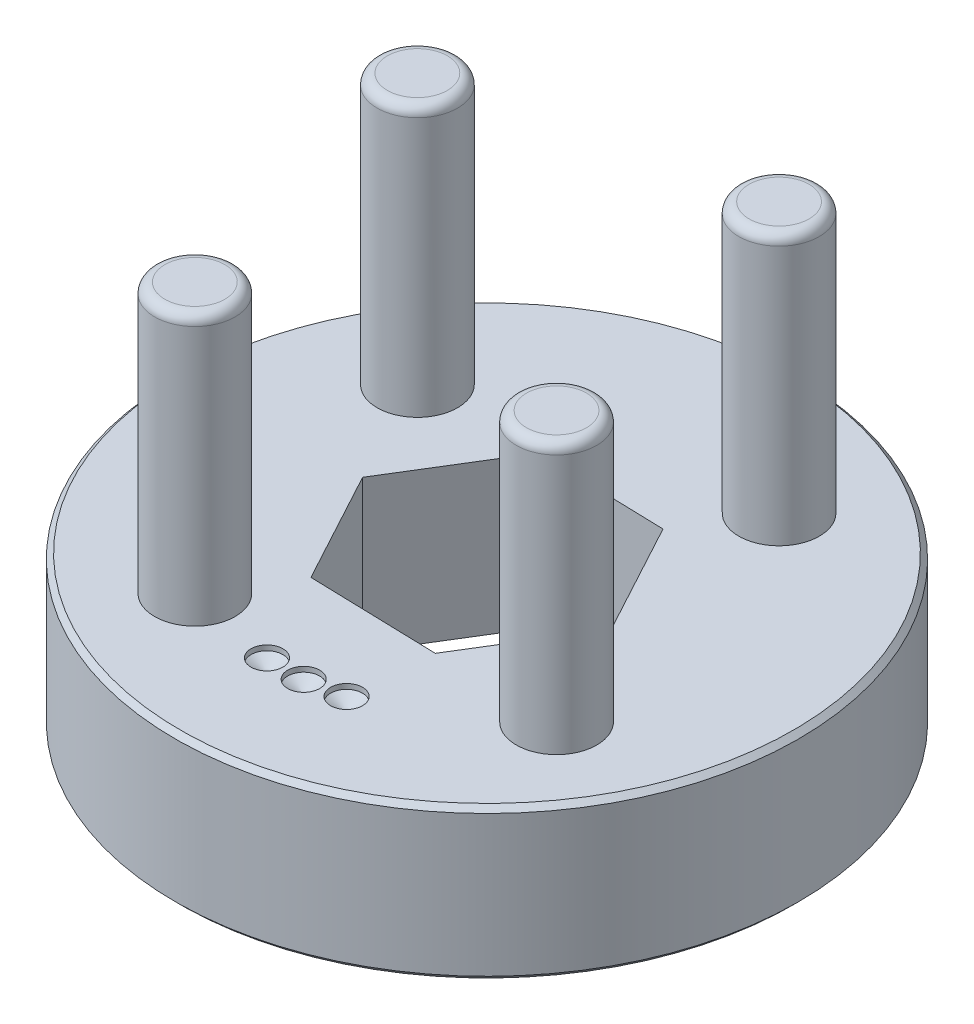
ISO-10303-21;
HEADER;
FILE_DESCRIPTION(('STEP AP214'),'2;1');
FILE_NAME('part.step','',(''),(''),'','','');
FILE_SCHEMA(('AUTOMOTIVE_DESIGN { 1 0 10303 214 1 1 1 1 }'));
ENDSEC;
DATA;
#1=APPLICATION_CONTEXT('core data for automotive mechanical design processes');
#2=APPLICATION_PROTOCOL_DEFINITION('international standard','automotive_design',2000,#1);
#3=PRODUCT_CONTEXT('',#1,'mechanical');
#4=PRODUCT('Part','Part','',(#3));
#5=PRODUCT_RELATED_PRODUCT_CATEGORY('part','',(#4));
#6=PRODUCT_DEFINITION_FORMATION('','',#4);
#7=PRODUCT_DEFINITION_CONTEXT('part definition',#1,'design');
#8=PRODUCT_DEFINITION('design','',#6,#7);
#9=PRODUCT_DEFINITION_SHAPE('','',#8);
#10=(LENGTH_UNIT() NAMED_UNIT(*) SI_UNIT(.MILLI.,.METRE.));
#11=(NAMED_UNIT(*) PLANE_ANGLE_UNIT() SI_UNIT($,.RADIAN.));
#12=(NAMED_UNIT(*) SI_UNIT($,.STERADIAN.) SOLID_ANGLE_UNIT());
#13=UNCERTAINTY_MEASURE_WITH_UNIT(LENGTH_MEASURE(1.E-05),#10,'distance_accuracy_value','');
#14=(GEOMETRIC_REPRESENTATION_CONTEXT(3) GLOBAL_UNCERTAINTY_ASSIGNED_CONTEXT((#13)) GLOBAL_UNIT_ASSIGNED_CONTEXT((#10,
#11,#12)) REPRESENTATION_CONTEXT('',''));
#15=CARTESIAN_POINT('',(0.,0.,0.));
#16=DIRECTION('',(0.,0.,1.));
#17=DIRECTION('',(1.,0.,0.));
#18=AXIS2_PLACEMENT_3D('',#15,#16,#17);
#19=CARTESIAN_POINT('',(30.3469887250442,1.0786969017347,21.9150914039625));
#20=DIRECTION('',(0.,1.,0.));
#21=DIRECTION('',(1.,0.,0.));
#22=AXIS2_PLACEMENT_3D('',#19,#20,#21);
#23=PLANE('',#22);
#24=CARTESIAN_POINT('',(30.3469887253936,1.0786969019887,21.9150914038793));
#25=DIRECTION('',(0.,1.,0.));
#26=DIRECTION('',(-0.524000361545256,0.,0.851718040844763));
#27=AXIS2_PLACEMENT_3D('',#24,#25,#26);
#28=CIRCLE('',#27,1.492000000254);
#29=CARTESIAN_POINT('',(29.565180185835,1.0786969019887,23.185854721036));
#30=VERTEX_POINT('',#29);
#31=EDGE_CURVE('E235',#30,#30,#28,.T.);
#32=ORIENTED_EDGE('',*,*,#31,.T.);
#33=EDGE_LOOP('',(#32));
#34=FACE_BOUND('',#33,.T.);
#35=ADVANCED_FACE('F17',(#34),#23,.T.);
#36=CARTESIAN_POINT('',(15.8228416918114,1.0786969017347,25.3749708031669));
#37=DIRECTION('',(0.,1.,0.));
#38=DIRECTION('',(1.,0.,0.));
#39=AXIS2_PLACEMENT_3D('',#36,#37,#38);
#40=PLANE('',#39);
#41=CARTESIAN_POINT('',(15.8228416915951,1.0786969019887,25.3749708030339));
#42=DIRECTION('',(0.,1.,0.));
#43=DIRECTION('',(-0.524000361545256,0.,0.851718040844763));
#44=AXIS2_PLACEMENT_3D('',#41,#42,#43);
#45=CIRCLE('',#44,1.492000000254);
#46=CARTESIAN_POINT('',(15.0410331520365,1.0786969019887,26.6457341201906));
#47=VERTEX_POINT('',#46);
#48=EDGE_CURVE('E242',#47,#47,#45,.T.);
#49=ORIENTED_EDGE('',*,*,#48,.T.);
#50=EDGE_LOOP('',(#49));
#51=FACE_BOUND('',#50,.T.);
#52=ADVANCED_FACE('F363',(#51),#40,.T.);
#53=CARTESIAN_POINT('',(19.282721091016,1.0786969017347,39.8991178363996));
#54=DIRECTION('',(0.,1.,0.));
#55=DIRECTION('',(1.,0.,0.));
#56=AXIS2_PLACEMENT_3D('',#53,#54,#55);
#57=PLANE('',#56);
#58=CARTESIAN_POINT('',(19.2827210906665,1.0786969019887,39.8991178364828));
#59=DIRECTION('',(0.,1.,0.));
#60=DIRECTION('',(-0.524000361545256,0.,0.851718040844763));
#61=AXIS2_PLACEMENT_3D('',#58,#59,#60);
#62=CIRCLE('',#61,1.492000000254);
#63=CARTESIAN_POINT('',(18.5009125511079,1.0786969019887,41.1698811536395));
#64=VERTEX_POINT('',#63);
#65=EDGE_CURVE('E223',#64,#64,#62,.T.);
#66=ORIENTED_EDGE('',*,*,#65,.T.);
#67=EDGE_LOOP('',(#66));
#68=FACE_BOUND('',#67,.T.);
#69=ADVANCED_FACE('F359',(#68),#57,.T.);
#70=CARTESIAN_POINT('',(33.8068681242486,1.0786969017347,36.439238437195));
#71=DIRECTION('',(0.,1.,0.));
#72=DIRECTION('',(1.,0.,0.));
#73=AXIS2_PLACEMENT_3D('',#70,#71,#72);
#74=PLANE('',#73);
#75=CARTESIAN_POINT('',(33.8068681244649,1.0786969019887,36.4392384373281));
#76=DIRECTION('',(0.,1.,0.));
#77=DIRECTION('',(-0.524000361545256,0.,0.851718040844763));
#78=AXIS2_PLACEMENT_3D('',#75,#76,#77);
#79=CIRCLE('',#78,1.492000000254);
#80=CARTESIAN_POINT('',(33.0250595849063,1.0786969019887,37.7100017544849));
#81=VERTEX_POINT('',#80);
#82=EDGE_CURVE('E218',#81,#81,#79,.T.);
#83=ORIENTED_EDGE('',*,*,#82,.T.);
#84=EDGE_LOOP('',(#83));
#85=FACE_BOUND('',#84,.T.);
#86=ADVANCED_FACE('F351',(#85),#74,.T.);
#87=CARTESIAN_POINT('',(21.480797807626,-19.8509030982653,36.326330998664));
#88=DIRECTION('',(-0.0279386042680408,0.,0.999609641005705));
#89=DIRECTION('',(0.,1.,0.));
#90=AXIS2_PLACEMENT_3D('',#87,#88,#89);
#91=PLANE('',#90);
#92=DIRECTION('',(0.999609641005707,0.,0.0279386042679472));
#93=VECTOR('',#92,1.);
#94=CARTESIAN_POINT('',(21.4807978072766,-12.3325030980113,36.3263309987472));
#95=LINE('',#94,#93);
#96=CARTESIAN_POINT('',(21.480797807626,-12.3325030982653,36.326330998664));
#97=VERTEX_POINT('',#96);
#98=CARTESIAN_POINT('',(27.8410140704531,-12.3325030982653,36.5040959560402));
#99=VERTEX_POINT('',#98);
#100=EDGE_CURVE('E292',#97,#99,#95,.T.);
#101=ORIENTED_EDGE('',*,*,#100,.T.);
#102=DIRECTION('',(0.,1.,0.));
#103=VECTOR('',#102,1.);
#104=CARTESIAN_POINT('',(27.8410140705363,-19.8509030982653,36.5040959563896));
#105=LINE('',#104,#103);
#106=CARTESIAN_POINT('',(27.8410140704531,-19.8509030982653,36.5040959560402));
#107=VERTEX_POINT('',#106);
#108=EDGE_CURVE('E11',#107,#99,#105,.T.);
#109=ORIENTED_EDGE('',*,*,#108,.F.);
#110=DIRECTION('',(0.999609641005707,0.,0.0279386042679472));
#111=VECTOR('',#110,1.);
#112=CARTESIAN_POINT('',(21.4807978072766,-19.8509030982653,36.3263309987472));
#113=LINE('',#112,#111);
#114=CARTESIAN_POINT('',(21.480797807626,-19.8509030982653,36.326330998664));
#115=VERTEX_POINT('',#114);
#116=EDGE_CURVE('E303',#115,#107,#113,.T.);
#117=ORIENTED_EDGE('',*,*,#116,.F.);
#118=DIRECTION('',(0.,1.,0.));
#119=VECTOR('',#118,1.);
#120=CARTESIAN_POINT('',(21.4807978072766,-19.8509030982653,36.3263309987472));
#121=LINE('',#120,#119);
#122=EDGE_CURVE('E154',#115,#97,#121,.T.);
#123=ORIENTED_EDGE('',*,*,#122,.T.);
#124=EDGE_LOOP('',(#101,#109,#117,#123));
#125=FACE_BOUND('',#124,.T.);
#126=ADVANCED_FACE('F349',(#125),#91,.F.);
#127=CARTESIAN_POINT('',(27.8410140704531,-19.8509030982653,36.5040959560402));
#128=DIRECTION('',(0.851718040844763,0.,0.524000361545256));
#129=DIRECTION('',(0.,-1.,0.));
#130=AXIS2_PLACEMENT_3D('',#127,#128,#129);
#131=PLANE('',#130);
#132=DIRECTION('',(0.524000361545256,0.,-0.851718040844763));
#133=VECTOR('',#132,1.);
#134=CARTESIAN_POINT('',(27.8410140705363,-12.3325030980113,36.5040959563896));
#135=LINE('',#134,#133);
#136=CARTESIAN_POINT('',(31.175071170857,-12.3325030982653,31.0848695775572));
#137=VERTEX_POINT('',#136);
#138=EDGE_CURVE('E288',#99,#137,#135,.T.);
#139=ORIENTED_EDGE('',*,*,#138,.T.);
#140=DIRECTION('',(0.,1.,0.));
#141=VECTOR('',#140,1.);
#142=CARTESIAN_POINT('',(31.1750711712065,-19.8509030982653,31.0848695774741));
#143=LINE('',#142,#141);
#144=CARTESIAN_POINT('',(31.175071170857,-19.8509030982653,31.0848695775572));
#145=VERTEX_POINT('',#144);
#146=EDGE_CURVE('E20',#145,#137,#143,.T.);
#147=ORIENTED_EDGE('',*,*,#146,.F.);
#148=DIRECTION('',(0.524000361545256,0.,-0.851718040844763));
#149=VECTOR('',#148,1.);
#150=CARTESIAN_POINT('',(27.8410140705363,-19.8509030982653,36.5040959563896));
#151=LINE('',#150,#149);
#152=EDGE_CURVE('E307',#107,#145,#151,.T.);
#153=ORIENTED_EDGE('',*,*,#152,.F.);
#154=ORIENTED_EDGE('',*,*,#108,.T.);
#155=EDGE_LOOP('',(#139,#147,#153,#154));
#156=FACE_BOUND('',#155,.T.);
#157=ADVANCED_FACE('F334',(#156),#131,.F.);
#158=CARTESIAN_POINT('',(31.175071170857,-19.8509030982653,31.0848695775572));
#159=DIRECTION('',(0.879656645112804,0.,-0.475609279460449));
#160=DIRECTION('',(0.,-1.,0.));
#161=AXIS2_PLACEMENT_3D('',#158,#159,#160);
#162=PLANE('',#161);
#163=DIRECTION('',(-0.475609279460367,0.,-0.879656645112848));
#164=VECTOR('',#163,1.);
#165=CARTESIAN_POINT('',(31.1750711712065,-12.3325030980113,31.0848695774741));
#166=LINE('',#165,#164);
#167=CARTESIAN_POINT('',(28.1489120084341,-12.3325030982653,25.4878782416981));
#168=VERTEX_POINT('',#167);
#169=EDGE_CURVE('E285',#137,#168,#166,.T.);
#170=ORIENTED_EDGE('',*,*,#169,.T.);
#171=DIRECTION('',(0.,1.,0.));
#172=VECTOR('',#171,1.);
#173=CARTESIAN_POINT('',(28.1489120083508,-19.8509030982653,25.4878782413486));
#174=LINE('',#173,#172);
#175=CARTESIAN_POINT('',(28.1489120084341,-19.8509030982653,25.4878782416981));
#176=VERTEX_POINT('',#175);
#177=EDGE_CURVE('E39',#176,#168,#174,.T.);
#178=ORIENTED_EDGE('',*,*,#177,.F.);
#179=DIRECTION('',(-0.475609279460367,0.,-0.879656645112848));
#180=VECTOR('',#179,1.);
#181=CARTESIAN_POINT('',(31.1750711712065,-19.8509030982653,31.0848695774741));
#182=LINE('',#181,#180);
#183=EDGE_CURVE('E311',#145,#176,#182,.T.);
#184=ORIENTED_EDGE('',*,*,#183,.F.);
#185=ORIENTED_EDGE('',*,*,#146,.T.);
#186=EDGE_LOOP('',(#170,#178,#184,#185));
#187=FACE_BOUND('',#186,.T.);
#188=ADVANCED_FACE('F329',(#187),#162,.F.);
#189=CARTESIAN_POINT('',(28.1489120084341,-19.8509030982653,25.4878782416981));
#190=DIRECTION('',(0.0279386042680408,0.,-0.999609641005705));
#191=DIRECTION('',(0.,-1.,0.));
#192=AXIS2_PLACEMENT_3D('',#189,#190,#191);
#193=PLANE('',#192);
#194=DIRECTION('',(-0.999609641005707,0.,-0.0279386042679472));
#195=VECTOR('',#194,1.);
#196=CARTESIAN_POINT('',(28.1489120083508,-12.3325030980113,25.4878782413486));
#197=LINE('',#196,#195);
#198=CARTESIAN_POINT('',(21.788695745607,-12.3325030982653,25.3101132843218));
#199=VERTEX_POINT('',#198);
#200=EDGE_CURVE('E281',#168,#199,#197,.T.);
#201=ORIENTED_EDGE('',*,*,#200,.T.);
#202=DIRECTION('',(0.,1.,0.));
#203=VECTOR('',#202,1.);
#204=CARTESIAN_POINT('',(21.7886957455238,-19.8509030982653,25.3101132839724));
#205=LINE('',#204,#203);
#206=CARTESIAN_POINT('',(21.788695745607,-19.8509030982653,25.3101132843218));
#207=VERTEX_POINT('',#206);
#208=EDGE_CURVE('E262',#207,#199,#205,.T.);
#209=ORIENTED_EDGE('',*,*,#208,.F.);
#210=DIRECTION('',(-0.999609641005707,0.,-0.0279386042679472));
#211=VECTOR('',#210,1.);
#212=CARTESIAN_POINT('',(28.1489120083508,-19.8509030982653,25.4878782413486));
#213=LINE('',#212,#211);
#214=EDGE_CURVE('E315',#176,#207,#213,.T.);
#215=ORIENTED_EDGE('',*,*,#214,.F.);
#216=ORIENTED_EDGE('',*,*,#177,.T.);
#217=EDGE_LOOP('',(#201,#209,#215,#216));
#218=FACE_BOUND('',#217,.T.);
#219=ADVANCED_FACE('F341',(#218),#193,.F.);
#220=CARTESIAN_POINT('',(21.788695745607,-19.8509030982653,25.3101132843218));
#221=DIRECTION('',(-0.851718040844763,0.,-0.524000361545256));
#222=DIRECTION('',(-0.524000361545256,0.,0.851718040844763));
#223=AXIS2_PLACEMENT_3D('',#220,#221,#222);
#224=PLANE('',#223);
#225=DIRECTION('',(-0.524000361545256,0.,0.851718040844763));
#226=VECTOR('',#225,1.);
#227=CARTESIAN_POINT('',(21.7886957455238,-12.3325030980113,25.3101132839724));
#228=LINE('',#227,#226);
#229=CARTESIAN_POINT('',(18.454638645203,-12.3325030982653,30.7293396628047));
#230=VERTEX_POINT('',#229);
#231=EDGE_CURVE('E277',#199,#230,#228,.T.);
#232=ORIENTED_EDGE('',*,*,#231,.T.);
#233=DIRECTION('',(0.,1.,0.));
#234=VECTOR('',#233,1.);
#235=CARTESIAN_POINT('',(18.4546386448536,-19.8509030982653,30.729339662888));
#236=LINE('',#235,#234);
#237=CARTESIAN_POINT('',(18.454638645203,-19.8509030982653,30.7293396628047));
#238=VERTEX_POINT('',#237);
#239=EDGE_CURVE('E265',#238,#230,#236,.T.);
#240=ORIENTED_EDGE('',*,*,#239,.F.);
#241=DIRECTION('',(-0.524000361545256,0.,0.851718040844763));
#242=VECTOR('',#241,1.);
#243=CARTESIAN_POINT('',(21.7886957455238,-19.8509030982653,25.3101132839724));
#244=LINE('',#243,#242);
#245=EDGE_CURVE('E295',#207,#238,#244,.T.);
#246=ORIENTED_EDGE('',*,*,#245,.F.);
#247=ORIENTED_EDGE('',*,*,#208,.T.);
#248=EDGE_LOOP('',(#232,#240,#246,#247));
#249=FACE_BOUND('',#248,.T.);
#250=ADVANCED_FACE('F347',(#249),#224,.F.);
#251=CARTESIAN_POINT('',(18.454638645203,-19.8509030982653,30.7293396628047));
#252=DIRECTION('',(-0.879656645112804,0.,0.475609279460449));
#253=DIRECTION('',(0.,1.,0.));
#254=AXIS2_PLACEMENT_3D('',#251,#252,#253);
#255=PLANE('',#254);
#256=DIRECTION('',(0.475609279460367,0.,0.879656645112848));
#257=VECTOR('',#256,1.);
#258=CARTESIAN_POINT('',(18.4546386448536,-12.3325030980113,30.729339662888));
#259=LINE('',#258,#257);
#260=EDGE_CURVE('E274',#230,#97,#259,.T.);
#261=ORIENTED_EDGE('',*,*,#260,.T.);
#262=ORIENTED_EDGE('',*,*,#122,.F.);
#263=DIRECTION('',(0.475609279460367,0.,0.879656645112848));
#264=VECTOR('',#263,1.);
#265=CARTESIAN_POINT('',(18.4546386448536,-19.8509030982653,30.729339662888));
#266=LINE('',#265,#264);
#267=EDGE_CURVE('E299',#238,#115,#266,.T.);
#268=ORIENTED_EDGE('',*,*,#267,.F.);
#269=ORIENTED_EDGE('',*,*,#239,.T.);
#270=EDGE_LOOP('',(#261,#262,#268,#269));
#271=FACE_BOUND('',#270,.T.);
#272=ADVANCED_FACE('F348',(#271),#255,.F.);
#273=CARTESIAN_POINT('',(24.81485490803,-19.8509030982653,30.907104620181));
#274=DIRECTION('',(0.,1.,0.));
#275=DIRECTION('',(1.,0.,0.));
#276=AXIS2_PLACEMENT_3D('',#273,#274,#275);
#277=PLANE('',#276);
#278=ORIENTED_EDGE('',*,*,#245,.T.);
#279=ORIENTED_EDGE('',*,*,#267,.T.);
#280=ORIENTED_EDGE('',*,*,#116,.T.);
#281=ORIENTED_EDGE('',*,*,#152,.T.);
#282=ORIENTED_EDGE('',*,*,#183,.T.);
#283=ORIENTED_EDGE('',*,*,#214,.T.);
#284=EDGE_LOOP('',(#278,#279,#280,#281,#282,#283));
#285=FACE_BOUND('',#284,.T.);
#286=CARTESIAN_POINT('',(24.81485490803,-19.8509030982653,30.907104620181));
#287=DIRECTION('',(0.,-1.,0.));
#288=DIRECTION('',(-0.524000361545256,0.,0.851718040844763));
#289=AXIS2_PLACEMENT_3D('',#286,#287,#288);
#290=CIRCLE('',#289,15.240000000254);
#291=CARTESIAN_POINT('',(16.8290893979473,-19.8509030982653,43.8872875628715));
#292=VERTEX_POINT('',#291);
#293=EDGE_CURVE('E271',#292,#292,#290,.T.);
#294=ORIENTED_EDGE('',*,*,#293,.T.);
#295=EDGE_LOOP('',(#294));
#296=FACE_BOUND('',#295,.T.);
#297=ADVANCED_FACE('F345',(#285,#296),#277,.F.);
#298=CARTESIAN_POINT('',(24.81485490803,-12.3325030982653,30.907104620181));
#299=DIRECTION('',(0.,1.,0.));
#300=DIRECTION('',(1.,0.,0.));
#301=AXIS2_PLACEMENT_3D('',#298,#299,#300);
#302=PLANE('',#301);
#303=ORIENTED_EDGE('',*,*,#260,.F.);
#304=ORIENTED_EDGE('',*,*,#231,.F.);
#305=ORIENTED_EDGE('',*,*,#200,.F.);
#306=ORIENTED_EDGE('',*,*,#169,.F.);
#307=ORIENTED_EDGE('',*,*,#138,.F.);
#308=ORIENTED_EDGE('',*,*,#100,.F.);
#309=EDGE_LOOP('',(#303,#304,#305,#306,#307,#308));
#310=FACE_BOUND('',#309,.T.);
#311=CARTESIAN_POINT('',(33.8068681244649,-12.3325030980113,36.4392384373281));
#312=DIRECTION('',(0.,1.,0.));
#313=DIRECTION('',(-0.524000361545256,0.,0.851718040844763));
#314=AXIS2_PLACEMENT_3D('',#311,#312,#313);
#315=CIRCLE('',#314,2.000000000254);
#316=CARTESIAN_POINT('',(32.7588674012413,-12.3325030980113,38.142674519234));
#317=VERTEX_POINT('',#316);
#318=EDGE_CURVE('E236',#317,#317,#315,.T.);
#319=ORIENTED_EDGE('',*,*,#318,.F.);
#320=EDGE_LOOP('',(#319));
#321=FACE_BOUND('',#320,.T.);
#322=CARTESIAN_POINT('',(19.2827210906665,-12.3325030980113,39.8991178364828));
#323=DIRECTION('',(0.,1.,0.));
#324=DIRECTION('',(-0.851718040778213,0.,-0.524000361653427));
#325=AXIS2_PLACEMENT_3D('',#322,#323,#324);
#326=CIRCLE('',#325,2.000000000254);
#327=CARTESIAN_POINT('',(17.5792850088938,-12.3325030980113,38.8511171130429));
#328=VERTEX_POINT('',#327);
#329=EDGE_CURVE('E222',#328,#328,#326,.T.);
#330=ORIENTED_EDGE('',*,*,#329,.F.);
#331=EDGE_LOOP('',(#330));
#332=FACE_BOUND('',#331,.T.);
#333=CARTESIAN_POINT('',(15.8228416915951,-12.3325030980113,25.3749708030339));
#334=DIRECTION('',(0.,1.,0.));
#335=DIRECTION('',(0.524000361545256,0.,-0.851718040844763));
#336=AXIS2_PLACEMENT_3D('',#333,#334,#335);
#337=CIRCLE('',#336,2.000000000254);
#338=CARTESIAN_POINT('',(16.8708424148187,-12.3325030980113,23.671534721128));
#339=VERTEX_POINT('',#338);
#340=EDGE_CURVE('E252',#339,#339,#337,.T.);
#341=ORIENTED_EDGE('',*,*,#340,.F.);
#342=EDGE_LOOP('',(#341));
#343=FACE_BOUND('',#342,.T.);
#344=CARTESIAN_POINT('',(30.3469887253936,-12.3325030980113,21.9150914038793));
#345=DIRECTION('',(0.,1.,0.));
#346=DIRECTION('',(0.851718040778209,0.,0.524000361653433));
#347=AXIS2_PLACEMENT_3D('',#344,#345,#346);
#348=CIRCLE('',#347,2.000000000254);
#349=CARTESIAN_POINT('',(32.0504248071664,-12.3325030980113,22.9630921273192));
#350=VERTEX_POINT('',#349);
#351=EDGE_CURVE('E230',#350,#350,#348,.T.);
#352=ORIENTED_EDGE('',*,*,#351,.F.);
#353=EDGE_LOOP('',(#352));
#354=FACE_BOUND('',#353,.T.);
#355=CARTESIAN_POINT('',(27.4947727017466,-12.3325030980113,40.5679838685067));
#356=DIRECTION('',(0.,1.,0.));
#357=DIRECTION('',(-0.524000361545256,0.,0.851718040844763));
#358=AXIS2_PLACEMENT_3D('',#355,#356,#357);
#359=CIRCLE('',#358,0.793750000253989);
#360=CARTESIAN_POINT('',(27.078847414637,-12.3325030980113,41.2440350636436));
#361=VERTEX_POINT('',#360);
#362=EDGE_CURVE('E186',#361,#361,#359,.T.);
#363=ORIENTED_EDGE('',*,*,#362,.F.);
#364=EDGE_LOOP('',(#363));
#365=FACE_BOUND('',#364,.T.);
#366=CARTESIAN_POINT('',(25.6893418241001,-12.3325030980113,40.8945877798845));
#367=DIRECTION('',(0.,1.,0.));
#368=DIRECTION('',(-0.524000361545256,0.,0.851718040844763));
#369=AXIS2_PLACEMENT_3D('',#366,#367,#368);
#370=CIRCLE('',#369,0.793750000253989);
#371=CARTESIAN_POINT('',(25.2734165369905,-12.3325030980113,41.5706389750213));
#372=VERTEX_POINT('',#371);
#373=EDGE_CURVE('E210',#372,#372,#370,.T.);
#374=ORIENTED_EDGE('',*,*,#373,.F.);
#375=EDGE_LOOP('',(#374));
#376=FACE_BOUND('',#375,.T.);
#377=CARTESIAN_POINT('',(23.8546242179689,-12.3325030980113,40.8867090338485));
#378=DIRECTION('',(0.,1.,0.));
#379=DIRECTION('',(-0.524000361545256,0.,0.851718040844763));
#380=AXIS2_PLACEMENT_3D('',#377,#378,#379);
#381=CIRCLE('',#380,0.793750000253989);
#382=CARTESIAN_POINT('',(23.4386989308593,-12.3325030980113,41.5627602289854));
#383=VERTEX_POINT('',#382);
#384=EDGE_CURVE('E200',#383,#383,#381,.T.);
#385=ORIENTED_EDGE('',*,*,#384,.F.);
#386=EDGE_LOOP('',(#385));
#387=FACE_BOUND('',#386,.T.);
#388=CARTESIAN_POINT('',(24.81485490803,-12.3325030980113,30.907104620181));
#389=DIRECTION('',(0.,1.,0.));
#390=DIRECTION('',(-0.524000361545256,0.,0.851718040844763));
#391=AXIS2_PLACEMENT_3D('',#388,#389,#390);
#392=CIRCLE('',#391,15.240000000254);
#393=CARTESIAN_POINT('',(16.8290893979473,-12.3325030980113,43.8872875628715));
#394=VERTEX_POINT('',#393);
#395=EDGE_CURVE('E261',#394,#394,#392,.T.);
#396=ORIENTED_EDGE('',*,*,#395,.T.);
#397=EDGE_LOOP('',(#396));
#398=FACE_BOUND('',#397,.T.);
#399=ADVANCED_FACE('F338',(#310,#321,#332,#343,#354,#365,#376,#387,#398),#302,.T.);
#400=CARTESIAN_POINT('',(24.81485490803,-12.3325030982653,30.907104620181));
#401=DIRECTION('',(0.,-1.,0.));
#402=DIRECTION('',(0.524000361545256,0.,-0.851718040844763));
#403=AXIS2_PLACEMENT_3D('',#400,#401,#402);
#404=CYLINDRICAL_SURFACE('',#403,15.494);
#405=CARTESIAN_POINT('',(24.81485490803,-12.5865030980113,30.907104620181));
#406=DIRECTION('',(0.,-1.,0.));
#407=DIRECTION('',(-0.524000361545256,0.,0.851718040844763));
#408=AXIS2_PLACEMENT_3D('',#405,#406,#407);
#409=CIRCLE('',#408,15.494000000254);
#410=CARTESIAN_POINT('',(16.6959933061148,-12.5865030980113,44.1036239452461));
#411=VERTEX_POINT('',#410);
#412=EDGE_CURVE('E239',#411,#411,#409,.T.);
#413=ORIENTED_EDGE('',*,*,#412,.T.);
#414=EDGE_LOOP('',(#413));
#415=FACE_BOUND('',#414,.T.);
#416=CARTESIAN_POINT('',(24.81485490803,-19.5969030980113,30.907104620181));
#417=DIRECTION('',(0.,1.,0.));
#418=DIRECTION('',(-0.524000361545256,0.,0.851718040844763));
#419=AXIS2_PLACEMENT_3D('',#416,#417,#418);
#420=CIRCLE('',#419,15.494000000254);
#421=CARTESIAN_POINT('',(16.6959933061148,-19.5969030980113,44.1036239452461));
#422=VERTEX_POINT('',#421);
#423=EDGE_CURVE('E267',#422,#422,#420,.T.);
#424=ORIENTED_EDGE('',*,*,#423,.T.);
#425=EDGE_LOOP('',(#424));
#426=FACE_BOUND('',#425,.T.);
#427=ADVANCED_FACE('F409',(#415,#426),#404,.T.);
#428=CARTESIAN_POINT('',(24.81485490803,-19.5969030982653,30.907104620181));
#429=DIRECTION('',(0.,1.,0.));
#430=DIRECTION('',(-0.524000361545256,0.,0.851718040844763));
#431=AXIS2_PLACEMENT_3D('',#428,#429,#430);
#432=CONICAL_SURFACE('',#431,15.494,0.785398163397459);
#433=ORIENTED_EDGE('',*,*,#293,.F.);
#434=EDGE_LOOP('',(#433));
#435=FACE_BOUND('',#434,.T.);
#436=ORIENTED_EDGE('',*,*,#423,.F.);
#437=EDGE_LOOP('',(#436));
#438=FACE_BOUND('',#437,.T.);
#439=ADVANCED_FACE('F407',(#435,#438),#432,.T.);
#440=CARTESIAN_POINT('',(24.81485490803,-12.3325030982653,30.907104620181));
#441=DIRECTION('',(0.,-1.,0.));
#442=DIRECTION('',(0.524000361545256,0.,-0.851718040844763));
#443=AXIS2_PLACEMENT_3D('',#440,#441,#442);
#444=CONICAL_SURFACE('',#443,15.24,0.785398163397441);
#445=ORIENTED_EDGE('',*,*,#395,.F.);
#446=EDGE_LOOP('',(#445));
#447=FACE_BOUND('',#446,.T.);
#448=ORIENTED_EDGE('',*,*,#412,.F.);
#449=EDGE_LOOP('',(#448));
#450=FACE_BOUND('',#449,.T.);
#451=ADVANCED_FACE('F404',(#447,#450),#444,.T.);
#452=CARTESIAN_POINT('',(33.8068681242486,1.0786969017347,36.439238437195));
#453=DIRECTION('',(0.,-1.,0.));
#454=DIRECTION('',(0.524000361545256,0.,-0.851718040844763));
#455=AXIS2_PLACEMENT_3D('',#452,#453,#454);
#456=CYLINDRICAL_SURFACE('',#455,2.);
#457=CARTESIAN_POINT('',(33.8068681244649,0.570696901988702,36.4392384373281));
#458=DIRECTION('',(0.,-1.,0.));
#459=DIRECTION('',(-0.524000361545256,0.,0.851718040844763));
#460=AXIS2_PLACEMENT_3D('',#457,#458,#459);
#461=CIRCLE('',#460,2.000000000254);
#462=CARTESIAN_POINT('',(32.7588674012413,0.570696901988702,38.142674519234));
#463=VERTEX_POINT('',#462);
#464=EDGE_CURVE('E221',#463,#463,#461,.T.);
#465=ORIENTED_EDGE('',*,*,#464,.T.);
#466=EDGE_LOOP('',(#465));
#467=FACE_BOUND('',#466,.T.);
#468=ORIENTED_EDGE('',*,*,#318,.T.);
#469=EDGE_LOOP('',(#468));
#470=FACE_BOUND('',#469,.T.);
#471=ADVANCED_FACE('F394',(#467,#470),#456,.T.);
#472=CARTESIAN_POINT('',(33.8068681242486,0.5706969017347,36.439238437195));
#473=DIRECTION('',(0.,1.,0.));
#474=DIRECTION('',(-0.524000361545256,0.,0.851718040844763));
#475=AXIS2_PLACEMENT_3D('',#472,#473,#474);
#476=TOROIDAL_SURFACE('',#475,1.492,0.508);
#477=ORIENTED_EDGE('',*,*,#464,.F.);
#478=EDGE_LOOP('',(#477));
#479=FACE_BOUND('',#478,.T.);
#480=ORIENTED_EDGE('',*,*,#82,.F.);
#481=EDGE_LOOP('',(#480));
#482=FACE_BOUND('',#481,.T.);
#483=ADVANCED_FACE('F390',(#479,#482),#476,.T.);
#484=CARTESIAN_POINT('',(19.282721091016,1.0786969017347,39.8991178363996));
#485=DIRECTION('',(0.,-1.,0.));
#486=DIRECTION('',(0.524000361545256,0.,-0.851718040844763));
#487=AXIS2_PLACEMENT_3D('',#484,#485,#486);
#488=CYLINDRICAL_SURFACE('',#487,2.);
#489=CARTESIAN_POINT('',(19.2827210906665,0.570696901988702,39.8991178364828));
#490=DIRECTION('',(0.,-1.,0.));
#491=DIRECTION('',(-0.524000361545256,0.,0.851718040844763));
#492=AXIS2_PLACEMENT_3D('',#489,#490,#491);
#493=CIRCLE('',#492,2.000000000254);
#494=CARTESIAN_POINT('',(18.2347203674429,0.570696901988702,41.6025539183887));
#495=VERTEX_POINT('',#494);
#496=EDGE_CURVE('E226',#495,#495,#493,.T.);
#497=ORIENTED_EDGE('',*,*,#496,.T.);
#498=EDGE_LOOP('',(#497));
#499=FACE_BOUND('',#498,.T.);
#500=ORIENTED_EDGE('',*,*,#329,.T.);
#501=EDGE_LOOP('',(#500));
#502=FACE_BOUND('',#501,.T.);
#503=ADVANCED_FACE('F393',(#499,#502),#488,.T.);
#504=CARTESIAN_POINT('',(15.8228416918114,1.0786969017347,25.3749708031669));
#505=DIRECTION('',(0.,-1.,0.));
#506=DIRECTION('',(0.524000361545256,0.,-0.851718040844763));
#507=AXIS2_PLACEMENT_3D('',#504,#505,#506);
#508=CYLINDRICAL_SURFACE('',#507,2.);
#509=CARTESIAN_POINT('',(15.8228416915951,0.570696901988702,25.3749708030339));
#510=DIRECTION('',(0.,-1.,0.));
#511=DIRECTION('',(-0.524000361545256,0.,0.851718040844763));
#512=AXIS2_PLACEMENT_3D('',#509,#510,#511);
#513=CIRCLE('',#512,2.000000000254);
#514=CARTESIAN_POINT('',(14.7748409683715,0.570696901988702,27.0784068849397));
#515=VERTEX_POINT('',#514);
#516=EDGE_CURVE('E227',#515,#515,#513,.T.);
#517=ORIENTED_EDGE('',*,*,#516,.T.);
#518=EDGE_LOOP('',(#517));
#519=FACE_BOUND('',#518,.T.);
#520=ORIENTED_EDGE('',*,*,#340,.T.);
#521=EDGE_LOOP('',(#520));
#522=FACE_BOUND('',#521,.T.);
#523=ADVANCED_FACE('F400',(#519,#522),#508,.T.);
#524=CARTESIAN_POINT('',(30.3469887250442,1.0786969017347,21.9150914039625));
#525=DIRECTION('',(0.,-1.,0.));
#526=DIRECTION('',(0.524000361545256,0.,-0.851718040844763));
#527=AXIS2_PLACEMENT_3D('',#524,#525,#526);
#528=CYLINDRICAL_SURFACE('',#527,2.);
#529=CARTESIAN_POINT('',(30.3469887253936,0.570696901988702,21.9150914038793));
#530=DIRECTION('',(0.,-1.,0.));
#531=DIRECTION('',(-0.524000361545256,0.,0.851718040844763));
#532=AXIS2_PLACEMENT_3D('',#529,#530,#531);
#533=CIRCLE('',#532,2.000000000254);
#534=CARTESIAN_POINT('',(29.29898800217,0.570696901988702,23.6185274857851));
#535=VERTEX_POINT('',#534);
#536=EDGE_CURVE('E245',#535,#535,#533,.T.);
#537=ORIENTED_EDGE('',*,*,#536,.T.);
#538=EDGE_LOOP('',(#537));
#539=FACE_BOUND('',#538,.T.);
#540=ORIENTED_EDGE('',*,*,#351,.T.);
#541=EDGE_LOOP('',(#540));
#542=FACE_BOUND('',#541,.T.);
#543=ADVANCED_FACE('F398',(#539,#542),#528,.T.);
#544=CARTESIAN_POINT('',(19.282721091016,0.5706969017347,39.8991178363996));
#545=DIRECTION('',(0.,1.,0.));
#546=DIRECTION('',(-0.524000361545256,0.,0.851718040844763));
#547=AXIS2_PLACEMENT_3D('',#544,#545,#546);
#548=TOROIDAL_SURFACE('',#547,1.492,0.508);
#549=ORIENTED_EDGE('',*,*,#496,.F.);
#550=EDGE_LOOP('',(#549));
#551=FACE_BOUND('',#550,.T.);
#552=ORIENTED_EDGE('',*,*,#65,.F.);
#553=EDGE_LOOP('',(#552));
#554=FACE_BOUND('',#553,.T.);
#555=ADVANCED_FACE('F384',(#551,#554),#548,.T.);
#556=CARTESIAN_POINT('',(15.8228416918114,0.5706969017347,25.3749708031669));
#557=DIRECTION('',(0.,1.,0.));
#558=DIRECTION('',(-0.524000361545256,0.,0.851718040844763));
#559=AXIS2_PLACEMENT_3D('',#556,#557,#558);
#560=TOROIDAL_SURFACE('',#559,1.492,0.508);
#561=ORIENTED_EDGE('',*,*,#516,.F.);
#562=EDGE_LOOP('',(#561));
#563=FACE_BOUND('',#562,.T.);
#564=ORIENTED_EDGE('',*,*,#48,.F.);
#565=EDGE_LOOP('',(#564));
#566=FACE_BOUND('',#565,.T.);
#567=ADVANCED_FACE('F374',(#563,#566),#560,.T.);
#568=CARTESIAN_POINT('',(30.3469887250442,0.5706969017347,21.9150914039625));
#569=DIRECTION('',(0.,1.,0.));
#570=DIRECTION('',(-0.524000361545256,0.,0.851718040844763));
#571=AXIS2_PLACEMENT_3D('',#568,#569,#570);
#572=TOROIDAL_SURFACE('',#571,1.492,0.508);
#573=ORIENTED_EDGE('',*,*,#536,.F.);
#574=EDGE_LOOP('',(#573));
#575=FACE_BOUND('',#574,.T.);
#576=ORIENTED_EDGE('',*,*,#31,.F.);
#577=EDGE_LOOP('',(#576));
#578=FACE_BOUND('',#577,.T.);
#579=ADVANCED_FACE('F371',(#575,#578),#572,.T.);
#580=CARTESIAN_POINT('',(27.4947727016634,-12.5865030982653,40.5679838681573));
#581=DIRECTION('',(0.,1.,0.));
#582=DIRECTION('',(-0.524000361545256,0.,0.851718040844763));
#583=AXIS2_PLACEMENT_3D('',#580,#581,#582);
#584=CONICAL_SURFACE('',#583,0.79375,1.02974425867665);
#585=CARTESIAN_POINT('',(27.4947727016634,-13.0634362146184,40.5679838681573));
#586=VERTEX_POINT('',#585);
#587=VERTEX_LOOP('',#586);
#588=FACE_BOUND('',#587,.T.);
#589=CARTESIAN_POINT('',(27.4947727017466,-12.5865030980113,40.5679838685067));
#590=DIRECTION('',(0.,1.,0.));
#591=DIRECTION('',(-0.524000361545256,0.,0.851718040844763));
#592=AXIS2_PLACEMENT_3D('',#589,#590,#591);
#593=CIRCLE('',#592,0.793750000253999);
#594=CARTESIAN_POINT('',(27.078847414637,-12.5865030980113,41.2440350636436));
#595=VERTEX_POINT('',#594);
#596=EDGE_CURVE('E178',#595,#595,#593,.T.);
#597=ORIENTED_EDGE('',*,*,#596,.T.);
#598=EDGE_LOOP('',(#597));
#599=FACE_BOUND('',#598,.T.);
#600=ADVANCED_FACE('F373',(#588,#599),#584,.F.);
#601=CARTESIAN_POINT('',(27.4947727016634,-12.3325030982653,40.5679838681573));
#602=DIRECTION('',(0.,1.,0.));
#603=DIRECTION('',(-0.524000361545256,0.,0.851718040844763));
#604=AXIS2_PLACEMENT_3D('',#601,#602,#603);
#605=CYLINDRICAL_SURFACE('',#604,0.79375);
#606=ORIENTED_EDGE('',*,*,#596,.F.);
#607=EDGE_LOOP('',(#606));
#608=FACE_BOUND('',#607,.T.);
#609=ORIENTED_EDGE('',*,*,#362,.T.);
#610=EDGE_LOOP('',(#609));
#611=FACE_BOUND('',#610,.T.);
#612=ADVANCED_FACE('F381',(#608,#611),#605,.F.);
#613=CARTESIAN_POINT('',(25.6893418240169,-12.5865030982653,40.894587779535));
#614=DIRECTION('',(0.,1.,0.));
#615=DIRECTION('',(-0.524000361545256,0.,0.851718040844763));
#616=AXIS2_PLACEMENT_3D('',#613,#614,#615);
#617=CONICAL_SURFACE('',#616,0.79375,1.02974425867665);
#618=CARTESIAN_POINT('',(25.6893418240169,-13.0634362146184,40.894587779535));
#619=VERTEX_POINT('',#618);
#620=VERTEX_LOOP('',#619);
#621=FACE_BOUND('',#620,.T.);
#622=CARTESIAN_POINT('',(25.6893418241001,-12.5865030980113,40.8945877798845));
#623=DIRECTION('',(0.,1.,0.));
#624=DIRECTION('',(-0.524000361545256,0.,0.851718040844763));
#625=AXIS2_PLACEMENT_3D('',#622,#623,#624);
#626=CIRCLE('',#625,0.793750000253999);
#627=CARTESIAN_POINT('',(25.2734165369905,-12.5865030980113,41.5706389750213));
#628=VERTEX_POINT('',#627);
#629=EDGE_CURVE('E215',#628,#628,#626,.T.);
#630=ORIENTED_EDGE('',*,*,#629,.T.);
#631=EDGE_LOOP('',(#630));
#632=FACE_BOUND('',#631,.T.);
#633=ADVANCED_FACE('F542',(#621,#632),#617,.F.);
#634=CARTESIAN_POINT('',(25.6893418240169,-12.3325030982653,40.894587779535));
#635=DIRECTION('',(0.,1.,0.));
#636=DIRECTION('',(-0.524000361545256,0.,0.851718040844763));
#637=AXIS2_PLACEMENT_3D('',#634,#635,#636);
#638=CYLINDRICAL_SURFACE('',#637,0.79375);
#639=ORIENTED_EDGE('',*,*,#629,.F.);
#640=EDGE_LOOP('',(#639));
#641=FACE_BOUND('',#640,.T.);
#642=ORIENTED_EDGE('',*,*,#373,.T.);
#643=EDGE_LOOP('',(#642));
#644=FACE_BOUND('',#643,.T.);
#645=ADVANCED_FACE('F553',(#641,#644),#638,.F.);
#646=CARTESIAN_POINT('',(23.8546242178857,-12.5865030982653,40.8867090334991));
#647=DIRECTION('',(0.,1.,0.));
#648=DIRECTION('',(-0.524000361545256,0.,0.851718040844763));
#649=AXIS2_PLACEMENT_3D('',#646,#647,#648);
#650=CONICAL_SURFACE('',#649,0.79375,1.02974425867665);
#651=CARTESIAN_POINT('',(23.8546242178857,-13.0634362146184,40.8867090334991));
#652=VERTEX_POINT('',#651);
#653=VERTEX_LOOP('',#652);
#654=FACE_BOUND('',#653,.T.);
#655=CARTESIAN_POINT('',(23.8546242179689,-12.5865030980113,40.8867090338485));
#656=DIRECTION('',(0.,1.,0.));
#657=DIRECTION('',(-0.524000361545256,0.,0.851718040844763));
#658=AXIS2_PLACEMENT_3D('',#655,#656,#657);
#659=CIRCLE('',#658,0.793750000253999);
#660=CARTESIAN_POINT('',(23.4386989308593,-12.5865030980113,41.5627602289854));
#661=VERTEX_POINT('',#660);
#662=EDGE_CURVE('E204',#661,#661,#659,.T.);
#663=ORIENTED_EDGE('',*,*,#662,.T.);
#664=EDGE_LOOP('',(#663));
#665=FACE_BOUND('',#664,.T.);
#666=ADVANCED_FACE('F564',(#654,#665),#650,.F.);
#667=CARTESIAN_POINT('',(23.8546242178857,-12.3325030982653,40.8867090334991));
#668=DIRECTION('',(0.,1.,0.));
#669=DIRECTION('',(-0.524000361545256,0.,0.851718040844763));
#670=AXIS2_PLACEMENT_3D('',#667,#668,#669);
#671=CYLINDRICAL_SURFACE('',#670,0.79375);
#672=ORIENTED_EDGE('',*,*,#662,.F.);
#673=EDGE_LOOP('',(#672));
#674=FACE_BOUND('',#673,.T.);
#675=ORIENTED_EDGE('',*,*,#384,.T.);
#676=EDGE_LOOP('',(#675));
#677=FACE_BOUND('',#676,.T.);
#678=ADVANCED_FACE('F201',(#674,#677),#671,.F.);
#679=CLOSED_SHELL('',(#35,#52,#69,#86,#126,#157,#188,#219,#250,#272,#297,#399,#427,#439,#451,
#471,#483,#503,#523,#543,#555,#567,#579,#600,#612,#633,#645,#666,#678));
#680=MANIFOLD_SOLID_BREP('B1',#679);
#681=ADVANCED_BREP_SHAPE_REPRESENTATION('',(#18,#680),#14);
#682=SHAPE_DEFINITION_REPRESENTATION(#9,#681);
ENDSEC;
END-ISO-10303-21;
